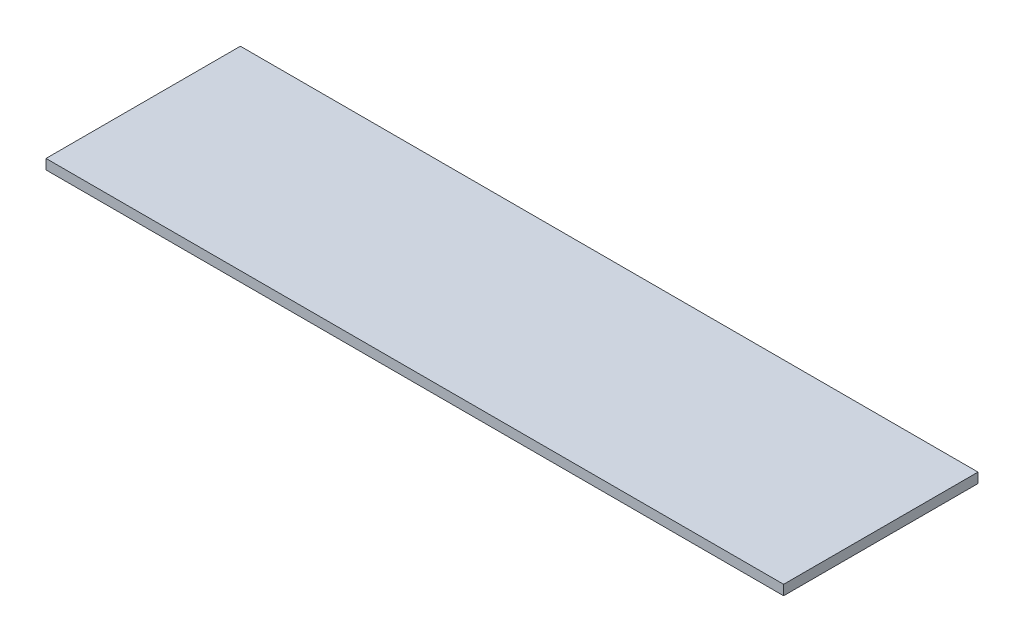
ISO-10303-21;
HEADER;
FILE_DESCRIPTION(('STEP AP214'),'2;1');
FILE_NAME('part.step','',(''),(''),'','','');
FILE_SCHEMA(('AUTOMOTIVE_DESIGN { 1 0 10303 214 1 1 1 1 }'));
ENDSEC;
DATA;
#1=APPLICATION_CONTEXT('core data for automotive mechanical design processes');
#2=APPLICATION_PROTOCOL_DEFINITION('international standard','automotive_design',2000,#1);
#3=PRODUCT_CONTEXT('',#1,'mechanical');
#4=PRODUCT('Part','Part','',(#3));
#5=PRODUCT_RELATED_PRODUCT_CATEGORY('part','',(#4));
#6=PRODUCT_DEFINITION_FORMATION('','',#4);
#7=PRODUCT_DEFINITION_CONTEXT('part definition',#1,'design');
#8=PRODUCT_DEFINITION('design','',#6,#7);
#9=PRODUCT_DEFINITION_SHAPE('','',#8);
#10=(LENGTH_UNIT() NAMED_UNIT(*) SI_UNIT(.MILLI.,.METRE.));
#11=(NAMED_UNIT(*) PLANE_ANGLE_UNIT() SI_UNIT($,.RADIAN.));
#12=(NAMED_UNIT(*) SI_UNIT($,.STERADIAN.) SOLID_ANGLE_UNIT());
#13=UNCERTAINTY_MEASURE_WITH_UNIT(LENGTH_MEASURE(1.E-05),#10,'distance_accuracy_value','');
#14=(GEOMETRIC_REPRESENTATION_CONTEXT(3) GLOBAL_UNCERTAINTY_ASSIGNED_CONTEXT((#13)) GLOBAL_UNIT_ASSIGNED_CONTEXT((#10,
#11,#12)) REPRESENTATION_CONTEXT('',''));
#15=CARTESIAN_POINT('',(0.,0.,0.));
#16=DIRECTION('',(0.,0.,1.));
#17=DIRECTION('',(1.,0.,0.));
#18=AXIS2_PLACEMENT_3D('',#15,#16,#17);
#19=CARTESIAN_POINT('',(-58.7503685417652,-6.35,-21.2331495001488));
#20=DIRECTION('',(-1.,0.,0.));
#21=DIRECTION('',(0.,0.,1.));
#22=AXIS2_PLACEMENT_3D('',#19,#20,#21);
#23=PLANE('',#22);
#24=DIRECTION('',(0.,0.,1.));
#25=VECTOR('',#24,1.);
#26=CARTESIAN_POINT('',(-58.7503685417652,0.,-21.2331495001488));
#27=LINE('',#26,#25);
#28=CARTESIAN_POINT('',(-58.7503685417652,0.,-21.2331495001488));
#29=VERTEX_POINT('',#28);
#30=CARTESIAN_POINT('',(-58.7503685417652,0.,102.591850499851));
#31=VERTEX_POINT('',#30);
#32=EDGE_CURVE('E96',#29,#31,#27,.T.);
#33=ORIENTED_EDGE('',*,*,#32,.F.);
#34=DIRECTION('',(0.,1.,0.));
#35=VECTOR('',#34,1.);
#36=CARTESIAN_POINT('',(-58.7503685417652,-6.35,-21.2331495001488));
#37=LINE('',#36,#35);
#38=CARTESIAN_POINT('',(-58.7503685417652,-6.35,-21.2331495001488));
#39=VERTEX_POINT('',#38);
#40=EDGE_CURVE('E11',#39,#29,#37,.T.);
#41=ORIENTED_EDGE('',*,*,#40,.F.);
#42=DIRECTION('',(0.,0.,1.));
#43=VECTOR('',#42,1.);
#44=CARTESIAN_POINT('',(-58.7503685417652,-6.35,-21.2331495001488));
#45=LINE('',#44,#43);
#46=CARTESIAN_POINT('',(-58.7503685417652,-6.35,102.591850499851));
#47=VERTEX_POINT('',#46);
#48=EDGE_CURVE('E90',#39,#47,#45,.T.);
#49=ORIENTED_EDGE('',*,*,#48,.T.);
#50=DIRECTION('',(0.,1.,0.));
#51=VECTOR('',#50,1.);
#52=CARTESIAN_POINT('',(-58.7503685417652,-6.35,102.591850499851));
#53=LINE('',#52,#51);
#54=EDGE_CURVE('E35',#47,#31,#53,.T.);
#55=ORIENTED_EDGE('',*,*,#54,.T.);
#56=EDGE_LOOP('',(#33,#41,#49,#55));
#57=FACE_BOUND('',#56,.T.);
#58=ADVANCED_FACE('F32',(#57),#23,.T.);
#59=CARTESIAN_POINT('',(-58.7503685417652,-6.35,-21.2331495001488));
#60=DIRECTION('',(0.,0.,-1.));
#61=DIRECTION('',(-1.,0.,0.));
#62=AXIS2_PLACEMENT_3D('',#59,#60,#61);
#63=PLANE('',#62);
#64=DIRECTION('',(-1.,0.,0.));
#65=VECTOR('',#64,1.);
#66=CARTESIAN_POINT('',(-58.7503685417652,0.,-21.2331495001488));
#67=LINE('',#66,#65);
#68=CARTESIAN_POINT('',(411.149631458235,0.,-21.2331495001488));
#69=VERTEX_POINT('',#68);
#70=EDGE_CURVE('E92',#69,#29,#67,.T.);
#71=ORIENTED_EDGE('',*,*,#70,.F.);
#72=DIRECTION('',(0.,1.,0.));
#73=VECTOR('',#72,1.);
#74=CARTESIAN_POINT('',(411.149631458235,-6.35,-21.2331495001488));
#75=LINE('',#74,#73);
#76=CARTESIAN_POINT('',(411.149631458235,-6.35,-21.2331495001488));
#77=VERTEX_POINT('',#76);
#78=EDGE_CURVE('E41',#77,#69,#75,.T.);
#79=ORIENTED_EDGE('',*,*,#78,.F.);
#80=DIRECTION('',(-1.,0.,0.));
#81=VECTOR('',#80,1.);
#82=CARTESIAN_POINT('',(-58.7503685417652,-6.35,-21.2331495001488));
#83=LINE('',#82,#81);
#84=EDGE_CURVE('E87',#77,#39,#83,.T.);
#85=ORIENTED_EDGE('',*,*,#84,.T.);
#86=ORIENTED_EDGE('',*,*,#40,.T.);
#87=EDGE_LOOP('',(#71,#79,#85,#86));
#88=FACE_BOUND('',#87,.T.);
#89=ADVANCED_FACE('F106',(#88),#63,.T.);
#90=CARTESIAN_POINT('',(411.149631458235,-6.35,-21.2331495001488));
#91=DIRECTION('',(1.,0.,0.));
#92=DIRECTION('',(0.,0.,-1.));
#93=AXIS2_PLACEMENT_3D('',#90,#91,#92);
#94=PLANE('',#93);
#95=DIRECTION('',(0.,0.,-1.));
#96=VECTOR('',#95,1.);
#97=CARTESIAN_POINT('',(411.149631458235,0.,-21.2331495001488));
#98=LINE('',#97,#96);
#99=CARTESIAN_POINT('',(411.149631458235,0.,102.591850499851));
#100=VERTEX_POINT('',#99);
#101=EDGE_CURVE('E82',#100,#69,#98,.T.);
#102=ORIENTED_EDGE('',*,*,#101,.F.);
#103=DIRECTION('',(0.,1.,0.));
#104=VECTOR('',#103,1.);
#105=CARTESIAN_POINT('',(411.149631458235,-6.35,102.591850499851));
#106=LINE('',#105,#104);
#107=CARTESIAN_POINT('',(411.149631458235,-6.35,102.591850499851));
#108=VERTEX_POINT('',#107);
#109=EDGE_CURVE('E77',#108,#100,#106,.T.);
#110=ORIENTED_EDGE('',*,*,#109,.F.);
#111=DIRECTION('',(0.,0.,-1.));
#112=VECTOR('',#111,1.);
#113=CARTESIAN_POINT('',(411.149631458235,-6.35,-21.2331495001488));
#114=LINE('',#113,#112);
#115=EDGE_CURVE('E80',#108,#77,#114,.T.);
#116=ORIENTED_EDGE('',*,*,#115,.T.);
#117=ORIENTED_EDGE('',*,*,#78,.T.);
#118=EDGE_LOOP('',(#102,#110,#116,#117));
#119=FACE_BOUND('',#118,.T.);
#120=ADVANCED_FACE('F79',(#119),#94,.T.);
#121=CARTESIAN_POINT('',(-58.7503685417652,-6.35,102.591850499851));
#122=DIRECTION('',(0.,0.,1.));
#123=DIRECTION('',(1.,0.,0.));
#124=AXIS2_PLACEMENT_3D('',#121,#122,#123);
#125=PLANE('',#124);
#126=DIRECTION('',(1.,0.,0.));
#127=VECTOR('',#126,1.);
#128=CARTESIAN_POINT('',(-58.7503685417652,0.,102.591850499851));
#129=LINE('',#128,#127);
#130=EDGE_CURVE('E99',#31,#100,#129,.T.);
#131=ORIENTED_EDGE('',*,*,#130,.F.);
#132=ORIENTED_EDGE('',*,*,#54,.F.);
#133=DIRECTION('',(1.,0.,0.));
#134=VECTOR('',#133,1.);
#135=CARTESIAN_POINT('',(-58.7503685417652,-6.35,102.591850499851));
#136=LINE('',#135,#134);
#137=EDGE_CURVE('E86',#47,#108,#136,.T.);
#138=ORIENTED_EDGE('',*,*,#137,.T.);
#139=ORIENTED_EDGE('',*,*,#109,.T.);
#140=EDGE_LOOP('',(#131,#132,#138,#139));
#141=FACE_BOUND('',#140,.T.);
#142=ADVANCED_FACE('F89',(#141),#125,.T.);
#143=CARTESIAN_POINT('',(-58.7503685417652,-6.35,102.591850499851));
#144=DIRECTION('',(0.,1.,0.));
#145=DIRECTION('',(0.,0.,1.));
#146=AXIS2_PLACEMENT_3D('',#143,#144,#145);
#147=PLANE('',#146);
#148=ORIENTED_EDGE('',*,*,#48,.F.);
#149=ORIENTED_EDGE('',*,*,#84,.F.);
#150=ORIENTED_EDGE('',*,*,#115,.F.);
#151=ORIENTED_EDGE('',*,*,#137,.F.);
#152=EDGE_LOOP('',(#148,#149,#150,#151));
#153=FACE_BOUND('',#152,.T.);
#154=ADVANCED_FACE('F85',(#153),#147,.F.);
#155=CARTESIAN_POINT('',(-58.7503685417652,0.,102.591850499851));
#156=DIRECTION('',(0.,1.,0.));
#157=DIRECTION('',(0.,0.,1.));
#158=AXIS2_PLACEMENT_3D('',#155,#156,#157);
#159=PLANE('',#158);
#160=ORIENTED_EDGE('',*,*,#32,.T.);
#161=ORIENTED_EDGE('',*,*,#130,.T.);
#162=ORIENTED_EDGE('',*,*,#101,.T.);
#163=ORIENTED_EDGE('',*,*,#70,.T.);
#164=EDGE_LOOP('',(#160,#161,#162,#163));
#165=FACE_BOUND('',#164,.T.);
#166=ADVANCED_FACE('F105',(#165),#159,.T.);
#167=CLOSED_SHELL('',(#58,#89,#120,#142,#154,#166));
#168=MANIFOLD_SOLID_BREP('B2',#167);
#169=ADVANCED_BREP_SHAPE_REPRESENTATION('',(#18,#168),#14);
#170=SHAPE_DEFINITION_REPRESENTATION(#9,#169);
ENDSEC;
END-ISO-10303-21;
